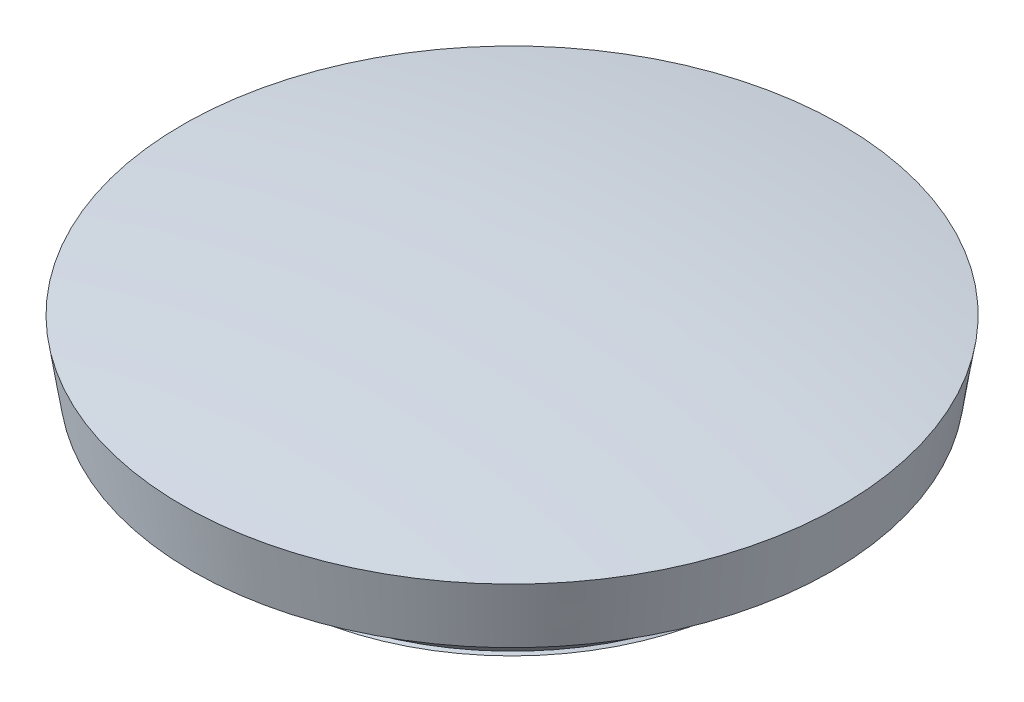
ISO-10303-21;
HEADER;
FILE_DESCRIPTION(('STEP AP214'),'2;1');
FILE_NAME('part.step','',(''),(''),'','','');
FILE_SCHEMA(('AUTOMOTIVE_DESIGN { 1 0 10303 214 1 1 1 1 }'));
ENDSEC;
DATA;
#1=APPLICATION_CONTEXT('core data for automotive mechanical design processes');
#2=APPLICATION_PROTOCOL_DEFINITION('international standard','automotive_design',2000,#1);
#3=PRODUCT_CONTEXT('',#1,'mechanical');
#4=PRODUCT('Part','Part','',(#3));
#5=PRODUCT_RELATED_PRODUCT_CATEGORY('part','',(#4));
#6=PRODUCT_DEFINITION_FORMATION('','',#4);
#7=PRODUCT_DEFINITION_CONTEXT('part definition',#1,'design');
#8=PRODUCT_DEFINITION('design','',#6,#7);
#9=PRODUCT_DEFINITION_SHAPE('','',#8);
#10=(LENGTH_UNIT() NAMED_UNIT(*) SI_UNIT(.MILLI.,.METRE.));
#11=(NAMED_UNIT(*) PLANE_ANGLE_UNIT() SI_UNIT($,.RADIAN.));
#12=(NAMED_UNIT(*) SI_UNIT($,.STERADIAN.) SOLID_ANGLE_UNIT());
#13=UNCERTAINTY_MEASURE_WITH_UNIT(LENGTH_MEASURE(1.E-05),#10,'distance_accuracy_value','');
#14=(GEOMETRIC_REPRESENTATION_CONTEXT(3) GLOBAL_UNCERTAINTY_ASSIGNED_CONTEXT((#13)) GLOBAL_UNIT_ASSIGNED_CONTEXT((#10,
#11,#12)) REPRESENTATION_CONTEXT('',''));
#15=CARTESIAN_POINT('',(0.,0.,0.));
#16=DIRECTION('',(0.,0.,1.));
#17=DIRECTION('',(1.,0.,0.));
#18=AXIS2_PLACEMENT_3D('',#15,#16,#17);
#19=CARTESIAN_POINT('',(0.,0.,0.));
#20=DIRECTION('',(0.,-1.,0.));
#21=DIRECTION('',(0.,0.,-1.));
#22=AXIS2_PLACEMENT_3D('',#19,#20,#21);
#23=SPHERICAL_SURFACE('',#22,332.);
#24=CARTESIAN_POINT('',(0.,328.289730936392,1.14621746929824E-12));
#25=DIRECTION('',(0.,-1.,0.));
#26=DIRECTION('',(0.,0.,-1.));
#27=AXIS2_PLACEMENT_3D('',#24,#25,#26);
#28=CIRCLE('',#27,49.4959853090285);
#29=CARTESIAN_POINT('',(0.,328.289730936392,-49.4959853090274));
#30=VERTEX_POINT('',#29);
#31=EDGE_CURVE('E10',#30,#30,#28,.T.);
#32=ORIENTED_EDGE('',*,*,#31,.F.);
#33=EDGE_LOOP('',(#32));
#34=FACE_BOUND('',#33,.T.);
#35=ADVANCED_FACE('F32',(#34),#23,.T.);
#36=CARTESIAN_POINT('',(0.,318.979376236805,1.11371053960663E-12));
#37=DIRECTION('',(0.,1.,0.));
#38=DIRECTION('',(0.,0.,1.));
#39=AXIS2_PLACEMENT_3D('',#36,#37,#38);
#40=CONICAL_SURFACE('',#39,48.0213699909285,0.157079632656758);
#41=ORIENTED_EDGE('',*,*,#31,.T.);
#42=EDGE_LOOP('',(#41));
#43=FACE_BOUND('',#42,.T.);
#44=CARTESIAN_POINT('',(0.,318.979376236805,1.11371053960663E-12));
#45=DIRECTION('',(0.,-1.,0.));
#46=DIRECTION('',(0.,0.,-1.));
#47=AXIS2_PLACEMENT_3D('',#44,#45,#46);
#48=CIRCLE('',#47,48.0213699909285);
#49=CARTESIAN_POINT('',(0.,318.979376236805,-48.0213699909274));
#50=VERTEX_POINT('',#49);
#51=EDGE_CURVE('E38',#50,#50,#48,.T.);
#52=ORIENTED_EDGE('',*,*,#51,.F.);
#53=EDGE_LOOP('',(#52));
#54=FACE_BOUND('',#53,.T.);
#55=ADVANCED_FACE('F87',(#43,#54),#40,.T.);
#56=CARTESIAN_POINT('',(0.,318.979376236805,-46.0927877598137));
#57=DIRECTION('',(0.,-1.,0.));
#58=DIRECTION('',(0.,0.,-1.));
#59=AXIS2_PLACEMENT_3D('',#56,#57,#58);
#60=PLANE('',#59);
#61=ORIENTED_EDGE('',*,*,#51,.T.);
#62=EDGE_LOOP('',(#61));
#63=FACE_BOUND('',#62,.T.);
#64=CARTESIAN_POINT('',(0.,318.979376236805,1.11371053960663E-12));
#65=DIRECTION('',(0.,-1.,0.));
#66=DIRECTION('',(0.,0.,-1.));
#67=AXIS2_PLACEMENT_3D('',#64,#65,#66);
#68=CIRCLE('',#67,46.0927877598148);
#69=CARTESIAN_POINT('',(0.,318.979376236805,-46.0927877598137));
#70=VERTEX_POINT('',#69);
#71=EDGE_CURVE('E42',#70,#70,#68,.T.);
#72=ORIENTED_EDGE('',*,*,#71,.F.);
#73=EDGE_LOOP('',(#72));
#74=FACE_BOUND('',#73,.T.);
#75=ADVANCED_FACE('F84',(#63,#74),#60,.T.);
#76=CARTESIAN_POINT('',(0.,319.342063422312,1.11497685514666E-12));
#77=DIRECTION('',(0.,-1.,0.));
#78=DIRECTION('',(0.,0.,-1.));
#79=AXIS2_PLACEMENT_3D('',#76,#77,#78);
#80=CONICAL_SURFACE('',#79,45.7486104719668,0.759218224617477);
#81=ORIENTED_EDGE('',*,*,#71,.T.);
#82=EDGE_LOOP('',(#81));
#83=FACE_BOUND('',#82,.T.);
#84=CARTESIAN_POINT('',(0.,319.342063422312,1.11497685514666E-12));
#85=DIRECTION('',(0.,-1.,0.));
#86=DIRECTION('',(0.,0.,-1.));
#87=AXIS2_PLACEMENT_3D('',#84,#85,#86);
#88=CIRCLE('',#87,45.7486104719668);
#89=CARTESIAN_POINT('',(0.,319.342063422312,-45.7486104719656));
#90=VERTEX_POINT('',#89);
#91=EDGE_CURVE('E46',#90,#90,#88,.T.);
#92=ORIENTED_EDGE('',*,*,#91,.F.);
#93=EDGE_LOOP('',(#92));
#94=FACE_BOUND('',#93,.T.);
#95=ADVANCED_FACE('F80',(#83,#94),#80,.F.);
#96=CARTESIAN_POINT('',(0.,309.789108636425,1.08162289178093E-12));
#97=DIRECTION('',(0.,1.,0.));
#98=DIRECTION('',(0.,0.,1.));
#99=AXIS2_PLACEMENT_3D('',#96,#97,#98);
#100=CONICAL_SURFACE('',#99,35.681896580901,0.81157810217688);
#101=ORIENTED_EDGE('',*,*,#91,.T.);
#102=EDGE_LOOP('',(#101));
#103=FACE_BOUND('',#102,.T.);
#104=CARTESIAN_POINT('',(0.,309.789108636425,1.08162289178093E-12));
#105=DIRECTION('',(0.,-1.,0.));
#106=DIRECTION('',(0.,0.,-1.));
#107=AXIS2_PLACEMENT_3D('',#104,#105,#106);
#108=CIRCLE('',#107,35.681896580901);
#109=CARTESIAN_POINT('',(0.,309.789108636425,-35.6818965808999));
#110=VERTEX_POINT('',#109);
#111=EDGE_CURVE('E51',#110,#110,#108,.T.);
#112=ORIENTED_EDGE('',*,*,#111,.F.);
#113=EDGE_LOOP('',(#112));
#114=FACE_BOUND('',#113,.T.);
#115=ADVANCED_FACE('F76',(#103,#114),#100,.T.);
#116=CARTESIAN_POINT('',(0.,309.426421450919,1.08035657624089E-12));
#117=DIRECTION('',(0.,-1.,0.));
#118=DIRECTION('',(0.,0.,-1.));
#119=AXIS2_PLACEMENT_3D('',#116,#117,#118);
#120=CONICAL_SURFACE('',#119,36.0260738687479,0.759218224617584);
#121=ORIENTED_EDGE('',*,*,#111,.T.);
#122=EDGE_LOOP('',(#121));
#123=FACE_BOUND('',#122,.T.);
#124=CARTESIAN_POINT('',(0.,309.426421450919,1.08035657624089E-12));
#125=DIRECTION('',(0.,-1.,0.));
#126=DIRECTION('',(0.,0.,-1.));
#127=AXIS2_PLACEMENT_3D('',#124,#125,#126);
#128=CIRCLE('',#127,36.0260738687479);
#129=CARTESIAN_POINT('',(0.,309.426421450919,-36.0260738687468));
#130=VERTEX_POINT('',#129);
#131=EDGE_CURVE('E54',#130,#130,#128,.T.);
#132=ORIENTED_EDGE('',*,*,#131,.F.);
#133=EDGE_LOOP('',(#132));
#134=FACE_BOUND('',#133,.T.);
#135=ADVANCED_FACE('F72',(#123,#134),#120,.T.);
#136=CARTESIAN_POINT('',(0.,324.00000132613,-3.29680710935289));
#137=CARTESIAN_POINT('',(0.,323.839631010621,-4.19716953330025));
#138=CARTESIAN_POINT('',(0.,323.815957426679,-5.69903077234639));
#139=CARTESIAN_POINT('',(0.,323.429691692967,-7.69349690876667));
#140=CARTESIAN_POINT('',(0.,323.156322342493,-9.27221547863295));
#141=CARTESIAN_POINT('',(0.,322.853770709841,-10.7506907556187));
#142=CARTESIAN_POINT('',(0.,322.557718534835,-12.181632664311));
#143=CARTESIAN_POINT('',(0.,322.313021033566,-13.6371518456547));
#144=CARTESIAN_POINT('',(0.,321.911666772609,-14.8643430011624));
#145=CARTESIAN_POINT('',(0.,321.566233217008,-15.911496119259));
#146=CARTESIAN_POINT('',(0.,321.24911896182,-16.8100082156303));
#147=CARTESIAN_POINT('',(0.,321.014944920148,-17.7338670648103));
#148=CARTESIAN_POINT('',(0.,320.641634287053,-18.8379169709903));
#149=CARTESIAN_POINT('',(0.,320.193493634444,-19.9309750743131));
#150=CARTESIAN_POINT('',(0.,319.694847457521,-21.0685888923534));
#151=CARTESIAN_POINT('',(0.,319.262698861091,-22.1409549770504));
#152=CARTESIAN_POINT('',(0.,318.685644378692,-23.2155911820915));
#153=CARTESIAN_POINT('',(0.,318.116301123266,-24.4370869753934));
#154=CARTESIAN_POINT('',(0.,317.351925715489,-25.6762426197938));
#155=CARTESIAN_POINT('',(0.,316.745495513305,-27.1206178706219));
#156=CARTESIAN_POINT('',(0.,315.773694322305,-28.4438432871393));
#157=CARTESIAN_POINT('',(0.,314.885066903903,-29.7447275960143));
#158=CARTESIAN_POINT('',(0.,313.930026131532,-31.0579996326754));
#159=CARTESIAN_POINT('',(0.,312.857808266779,-32.1956045250097));
#160=CARTESIAN_POINT('',(0.,311.851350636674,-33.3388464714454));
#161=CARTESIAN_POINT('',(0.,310.791334864412,-34.6626633336016));
#162=CARTESIAN_POINT('',(0.,309.864813343064,-35.4185995991861));
#163=CARTESIAN_POINT('',(0.,309.426421450919,-36.0260738687468));
#164=B_SPLINE_CURVE_WITH_KNOTS('',3,(#136,#137,#138,#139,#140,#141,#142,#143,#144,#145,#146,
#147,#148,#149,#150,#151,#152,#153,#154,#155,#156,#157,#158,#159,#160,#161,#162,#163),
.UNSPECIFIED.,.F.,.F.,(4,1,1,1,1,1,1,1,1,1,1,1,1,1,1,1,1,1,1,1,1,1,1,1,1,4),(0.,
0.0747545190514439,0.122349487540819,0.166091388003931,0.205989803778184,0.245887431215711,
0.285785104843161,0.326631637047987,0.351374957419917,0.376120069183818,0.404597675351736,
0.42934483628291,0.47148497351776,0.501275380527722,0.531074115732038,0.566064204480763,
0.601057593892019,0.641339688376931,0.685079139603855,0.728653083964336,0.775152986899672,
0.814276020651661,0.861387150749691,0.902976247600254,0.939044503089975,1.),.UNSPECIFIED.);
#165=CARTESIAN_POINT('',(0.,0.,0.));
#166=DIRECTION('',(0.,-1.,0.));
#167=AXIS1_PLACEMENT('',#165,#166);
#168=SURFACE_OF_REVOLUTION('',#164,#167);
#169=ORIENTED_EDGE('',*,*,#131,.T.);
#170=EDGE_LOOP('',(#169));
#171=FACE_BOUND('',#170,.T.);
#172=CARTESIAN_POINT('',(0.,324.00000132613,1.13123995841533E-12));
#173=DIRECTION('',(0.,-1.,0.));
#174=DIRECTION('',(0.,0.,-1.));
#175=AXIS2_PLACEMENT_3D('',#172,#173,#174);
#176=CIRCLE('',#175,3.29680710935402);
#177=CARTESIAN_POINT('',(0.,324.00000132613,-3.29680710935289));
#178=VERTEX_POINT('',#177);
#179=EDGE_CURVE('E57',#178,#178,#176,.T.);
#180=ORIENTED_EDGE('',*,*,#179,.F.);
#181=EDGE_LOOP('',(#180));
#182=FACE_BOUND('',#181,.T.);
#183=ADVANCED_FACE('F67',(#171,#182),#168,.F.);
#184=CARTESIAN_POINT('',(0.,324.000000663065,-3.29680710935289));
#185=DIRECTION('',(0.,-1.,0.));
#186=DIRECTION('',(0.,0.,-1.));
#187=AXIS2_PLACEMENT_3D('',#184,#185,#186);
#188=PLANE('',#187);
#189=ORIENTED_EDGE('',*,*,#179,.T.);
#190=EDGE_LOOP('',(#189));
#191=FACE_BOUND('',#190,.T.);
#192=ADVANCED_FACE('F71',(#191),#188,.T.);
#193=CLOSED_SHELL('',(#35,#55,#75,#95,#115,#135,#183,#192));
#194=MANIFOLD_SOLID_BREP('B2',#193);
#195=ADVANCED_BREP_SHAPE_REPRESENTATION('',(#18,#194),#14);
#196=SHAPE_DEFINITION_REPRESENTATION(#9,#195);
ENDSEC;
END-ISO-10303-21;
